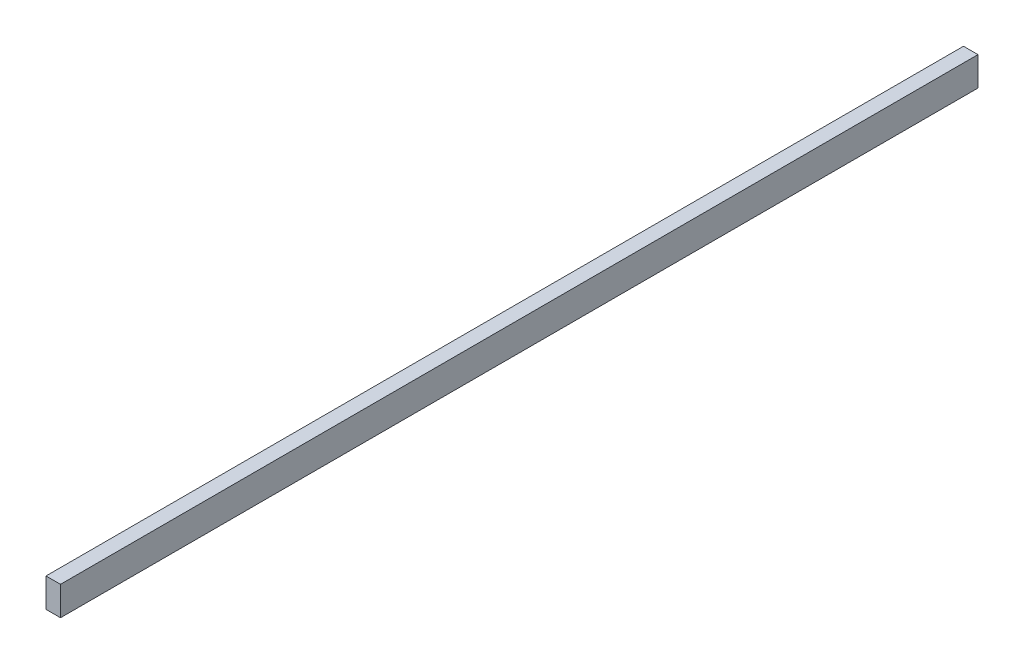
ISO-10303-21;
HEADER;
FILE_DESCRIPTION(('STEP AP214'),'2;1');
FILE_NAME('part.step','',(''),(''),'','','');
FILE_SCHEMA(('AUTOMOTIVE_DESIGN { 1 0 10303 214 1 1 1 1 }'));
ENDSEC;
DATA;
#1=APPLICATION_CONTEXT('core data for automotive mechanical design processes');
#2=APPLICATION_PROTOCOL_DEFINITION('international standard','automotive_design',2000,#1);
#3=PRODUCT_CONTEXT('',#1,'mechanical');
#4=PRODUCT('Part','Part','',(#3));
#5=PRODUCT_RELATED_PRODUCT_CATEGORY('part','',(#4));
#6=PRODUCT_DEFINITION_FORMATION('','',#4);
#7=PRODUCT_DEFINITION_CONTEXT('part definition',#1,'design');
#8=PRODUCT_DEFINITION('design','',#6,#7);
#9=PRODUCT_DEFINITION_SHAPE('','',#8);
#10=(LENGTH_UNIT() NAMED_UNIT(*) SI_UNIT(.MILLI.,.METRE.));
#11=(NAMED_UNIT(*) PLANE_ANGLE_UNIT() SI_UNIT($,.RADIAN.));
#12=(NAMED_UNIT(*) SI_UNIT($,.STERADIAN.) SOLID_ANGLE_UNIT());
#13=UNCERTAINTY_MEASURE_WITH_UNIT(LENGTH_MEASURE(1.E-05),#10,'distance_accuracy_value','');
#14=(GEOMETRIC_REPRESENTATION_CONTEXT(3) GLOBAL_UNCERTAINTY_ASSIGNED_CONTEXT((#13)) GLOBAL_UNIT_ASSIGNED_CONTEXT((#10,
#11,#12)) REPRESENTATION_CONTEXT('',''));
#15=CARTESIAN_POINT('',(0.,0.,0.));
#16=DIRECTION('',(0.,0.,1.));
#17=DIRECTION('',(1.,0.,0.));
#18=AXIS2_PLACEMENT_3D('',#15,#16,#17);
#19=CARTESIAN_POINT('',(-590.55,19.05,603.25));
#20=DIRECTION('',(1.,0.,0.));
#21=DIRECTION('',(0.,0.,-1.));
#22=AXIS2_PLACEMENT_3D('',#19,#20,#21);
#23=PLANE('',#22);
#24=DIRECTION('',(0.,1.,0.));
#25=VECTOR('',#24,1.);
#26=CARTESIAN_POINT('',(-590.55,19.05,603.25));
#27=LINE('',#26,#25);
#28=CARTESIAN_POINT('',(-590.55,19.05,603.25));
#29=VERTEX_POINT('',#28);
#30=CARTESIAN_POINT('',(-590.55,57.15,603.25));
#31=VERTEX_POINT('',#30);
#32=EDGE_CURVE('E18',#29,#31,#27,.T.);
#33=ORIENTED_EDGE('',*,*,#32,.F.);
#34=DIRECTION('',(0.,0.,1.));
#35=VECTOR('',#34,1.);
#36=CARTESIAN_POINT('',(-590.55,19.05,0.));
#37=LINE('',#36,#35);
#38=CARTESIAN_POINT('',(-590.55,19.05,-603.25));
#39=VERTEX_POINT('',#38);
#40=EDGE_CURVE('E78',#29,#39,#37,.F.);
#41=ORIENTED_EDGE('',*,*,#40,.T.);
#42=DIRECTION('',(0.,1.,0.));
#43=VECTOR('',#42,1.);
#44=CARTESIAN_POINT('',(-590.55,19.05,-603.25));
#45=LINE('',#44,#43);
#46=CARTESIAN_POINT('',(-590.55,57.15,-603.25));
#47=VERTEX_POINT('',#46);
#48=EDGE_CURVE('E66',#47,#39,#45,.F.);
#49=ORIENTED_EDGE('',*,*,#48,.F.);
#50=DIRECTION('',(0.,0.,1.));
#51=VECTOR('',#50,1.);
#52=CARTESIAN_POINT('',(-590.55,57.15,0.));
#53=LINE('',#52,#51);
#54=EDGE_CURVE('E54',#31,#47,#53,.F.);
#55=ORIENTED_EDGE('',*,*,#54,.F.);
#56=EDGE_LOOP('',(#33,#41,#49,#55));
#57=FACE_BOUND('',#56,.T.);
#58=ADVANCED_FACE('F15',(#57),#23,.T.);
#59=CARTESIAN_POINT('',(-609.6,19.05,603.25));
#60=DIRECTION('',(0.,0.,1.));
#61=DIRECTION('',(1.,0.,0.));
#62=AXIS2_PLACEMENT_3D('',#59,#60,#61);
#63=PLANE('',#62);
#64=DIRECTION('',(0.,1.,0.));
#65=VECTOR('',#64,1.);
#66=CARTESIAN_POINT('',(-609.6,19.05,603.25));
#67=LINE('',#66,#65);
#68=CARTESIAN_POINT('',(-609.6,19.05,603.25));
#69=VERTEX_POINT('',#68);
#70=CARTESIAN_POINT('',(-609.6,57.15,603.25));
#71=VERTEX_POINT('',#70);
#72=EDGE_CURVE('E81',#69,#71,#67,.T.);
#73=ORIENTED_EDGE('',*,*,#72,.F.);
#74=DIRECTION('',(1.,0.,0.));
#75=VECTOR('',#74,1.);
#76=CARTESIAN_POINT('',(0.,19.05,603.25));
#77=LINE('',#76,#75);
#78=EDGE_CURVE('E63',#69,#29,#77,.T.);
#79=ORIENTED_EDGE('',*,*,#78,.T.);
#80=ORIENTED_EDGE('',*,*,#32,.T.);
#81=DIRECTION('',(1.,0.,0.));
#82=VECTOR('',#81,1.);
#83=CARTESIAN_POINT('',(0.,57.15,603.25));
#84=LINE('',#83,#82);
#85=EDGE_CURVE('E60',#71,#31,#84,.T.);
#86=ORIENTED_EDGE('',*,*,#85,.F.);
#87=EDGE_LOOP('',(#73,#79,#80,#86));
#88=FACE_BOUND('',#87,.T.);
#89=ADVANCED_FACE('F59',(#88),#63,.T.);
#90=CARTESIAN_POINT('',(0.,57.15,0.));
#91=DIRECTION('',(0.,1.,0.));
#92=DIRECTION('',(0.,0.,1.));
#93=AXIS2_PLACEMENT_3D('',#90,#91,#92);
#94=PLANE('',#93);
#95=DIRECTION('',(-1.,0.,0.));
#96=VECTOR('',#95,1.);
#97=CARTESIAN_POINT('',(-590.55,57.15,-603.25));
#98=LINE('',#97,#96);
#99=CARTESIAN_POINT('',(-609.6,57.15,-603.25));
#100=VERTEX_POINT('',#99);
#101=EDGE_CURVE('E68',#100,#47,#98,.F.);
#102=ORIENTED_EDGE('',*,*,#101,.F.);
#103=DIRECTION('',(0.,0.,1.));
#104=VECTOR('',#103,1.);
#105=CARTESIAN_POINT('',(-609.6,57.15,-603.25));
#106=LINE('',#105,#104);
#107=EDGE_CURVE('E72',#71,#100,#106,.F.);
#108=ORIENTED_EDGE('',*,*,#107,.F.);
#109=ORIENTED_EDGE('',*,*,#85,.T.);
#110=ORIENTED_EDGE('',*,*,#54,.T.);
#111=EDGE_LOOP('',(#102,#108,#109,#110));
#112=FACE_BOUND('',#111,.T.);
#113=ADVANCED_FACE('F70',(#112),#94,.T.);
#114=CARTESIAN_POINT('',(-590.55,19.05,-603.25));
#115=DIRECTION('',(0.,0.,-1.));
#116=DIRECTION('',(-1.,0.,0.));
#117=AXIS2_PLACEMENT_3D('',#114,#115,#116);
#118=PLANE('',#117);
#119=ORIENTED_EDGE('',*,*,#48,.T.);
#120=DIRECTION('',(1.,0.,0.));
#121=VECTOR('',#120,1.);
#122=CARTESIAN_POINT('',(0.,19.05,-603.25));
#123=LINE('',#122,#121);
#124=CARTESIAN_POINT('',(-609.6,19.05,-603.25));
#125=VERTEX_POINT('',#124);
#126=EDGE_CURVE('E33',#39,#125,#123,.F.);
#127=ORIENTED_EDGE('',*,*,#126,.T.);
#128=DIRECTION('',(0.,1.,0.));
#129=VECTOR('',#128,1.);
#130=CARTESIAN_POINT('',(-609.6,19.05,-603.25));
#131=LINE('',#130,#129);
#132=EDGE_CURVE('E24',#100,#125,#131,.F.);
#133=ORIENTED_EDGE('',*,*,#132,.F.);
#134=ORIENTED_EDGE('',*,*,#101,.T.);
#135=EDGE_LOOP('',(#119,#127,#133,#134));
#136=FACE_BOUND('',#135,.T.);
#137=ADVANCED_FACE('F87',(#136),#118,.T.);
#138=CARTESIAN_POINT('',(0.,19.05,0.));
#139=DIRECTION('',(0.,1.,0.));
#140=DIRECTION('',(0.,0.,1.));
#141=AXIS2_PLACEMENT_3D('',#138,#139,#140);
#142=PLANE('',#141);
#143=ORIENTED_EDGE('',*,*,#40,.F.);
#144=ORIENTED_EDGE('',*,*,#78,.F.);
#145=DIRECTION('',(0.,0.,1.));
#146=VECTOR('',#145,1.);
#147=CARTESIAN_POINT('',(-609.6,19.05,-603.25));
#148=LINE('',#147,#146);
#149=EDGE_CURVE('E10',#125,#69,#148,.T.);
#150=ORIENTED_EDGE('',*,*,#149,.F.);
#151=ORIENTED_EDGE('',*,*,#126,.F.);
#152=EDGE_LOOP('',(#143,#144,#150,#151));
#153=FACE_BOUND('',#152,.T.);
#154=ADVANCED_FACE('F89',(#153),#142,.F.);
#155=CARTESIAN_POINT('',(-609.6,19.05,-603.25));
#156=DIRECTION('',(-1.,0.,0.));
#157=DIRECTION('',(0.,0.,1.));
#158=AXIS2_PLACEMENT_3D('',#155,#156,#157);
#159=PLANE('',#158);
#160=ORIENTED_EDGE('',*,*,#132,.T.);
#161=ORIENTED_EDGE('',*,*,#149,.T.);
#162=ORIENTED_EDGE('',*,*,#72,.T.);
#163=ORIENTED_EDGE('',*,*,#107,.T.);
#164=EDGE_LOOP('',(#160,#161,#162,#163));
#165=FACE_BOUND('',#164,.T.);
#166=ADVANCED_FACE('F86',(#165),#159,.T.);
#167=CLOSED_SHELL('',(#58,#89,#113,#137,#154,#166));
#168=MANIFOLD_SOLID_BREP('B1',#167);
#169=ADVANCED_BREP_SHAPE_REPRESENTATION('',(#18,#168),#14);
#170=SHAPE_DEFINITION_REPRESENTATION(#9,#169);
ENDSEC;
END-ISO-10303-21;
